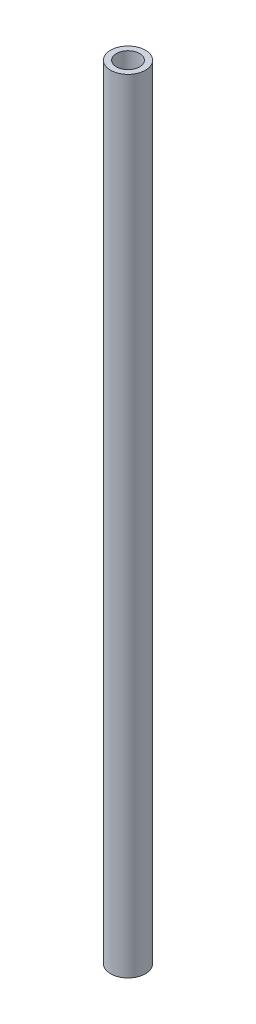
ISO-10303-21;
HEADER;
FILE_DESCRIPTION(('STEP AP214'),'2;1');
FILE_NAME('part.step','',(''),(''),'','','');
FILE_SCHEMA(('AUTOMOTIVE_DESIGN { 1 0 10303 214 1 1 1 1 }'));
ENDSEC;
DATA;
#1=APPLICATION_CONTEXT('core data for automotive mechanical design processes');
#2=APPLICATION_PROTOCOL_DEFINITION('international standard','automotive_design',2000,#1);
#3=PRODUCT_CONTEXT('',#1,'mechanical');
#4=PRODUCT('Part','Part','',(#3));
#5=PRODUCT_RELATED_PRODUCT_CATEGORY('part','',(#4));
#6=PRODUCT_DEFINITION_FORMATION('','',#4);
#7=PRODUCT_DEFINITION_CONTEXT('part definition',#1,'design');
#8=PRODUCT_DEFINITION('design','',#6,#7);
#9=PRODUCT_DEFINITION_SHAPE('','',#8);
#10=(LENGTH_UNIT() NAMED_UNIT(*) SI_UNIT(.MILLI.,.METRE.));
#11=(NAMED_UNIT(*) PLANE_ANGLE_UNIT() SI_UNIT($,.RADIAN.));
#12=(NAMED_UNIT(*) SI_UNIT($,.STERADIAN.) SOLID_ANGLE_UNIT());
#13=UNCERTAINTY_MEASURE_WITH_UNIT(LENGTH_MEASURE(1.E-05),#10,'distance_accuracy_value','');
#14=(GEOMETRIC_REPRESENTATION_CONTEXT(3) GLOBAL_UNCERTAINTY_ASSIGNED_CONTEXT((#13)) GLOBAL_UNIT_ASSIGNED_CONTEXT((#10,
#11,#12)) REPRESENTATION_CONTEXT('',''));
#15=CARTESIAN_POINT('',(0.,0.,0.));
#16=DIRECTION('',(0.,0.,1.));
#17=DIRECTION('',(1.,0.,0.));
#18=AXIS2_PLACEMENT_3D('',#15,#16,#17);
#19=CARTESIAN_POINT('',(3.,-100.,0.));
#20=DIRECTION('',(0.,-1.,0.));
#21=DIRECTION('',(0.,0.,-1.));
#22=AXIS2_PLACEMENT_3D('',#19,#20,#21);
#23=PLANE('',#22);
#24=CARTESIAN_POINT('',(0.,-100.,0.));
#25=DIRECTION('',(0.,-1.,0.));
#26=DIRECTION('',(0.,0.,-1.));
#27=AXIS2_PLACEMENT_3D('',#24,#25,#26);
#28=CIRCLE('',#27,3.);
#29=CARTESIAN_POINT('',(0.,-100.,-3.));
#30=VERTEX_POINT('',#29);
#31=EDGE_CURVE('E49',#30,#30,#28,.T.);
#32=ORIENTED_EDGE('',*,*,#31,.T.);
#33=EDGE_LOOP('',(#32));
#34=FACE_BOUND('',#33,.T.);
#35=CARTESIAN_POINT('',(0.,-100.,0.));
#36=DIRECTION('',(0.,-1.,0.));
#37=DIRECTION('',(0.,0.,-1.));
#38=AXIS2_PLACEMENT_3D('',#35,#36,#37);
#39=CIRCLE('',#38,2.);
#40=CARTESIAN_POINT('',(0.,-100.,-2.));
#41=VERTEX_POINT('',#40);
#42=EDGE_CURVE('E10',#41,#41,#39,.T.);
#43=ORIENTED_EDGE('',*,*,#42,.F.);
#44=EDGE_LOOP('',(#43));
#45=FACE_BOUND('',#44,.T.);
#46=ADVANCED_FACE('F35',(#34,#45),#23,.T.);
#47=CARTESIAN_POINT('',(0.,-200.,0.));
#48=DIRECTION('',(0.,-1.,0.));
#49=DIRECTION('',(0.,0.,-1.));
#50=AXIS2_PLACEMENT_3D('',#47,#48,#49);
#51=CYLINDRICAL_SURFACE('',#50,2.);
#52=ORIENTED_EDGE('',*,*,#42,.T.);
#53=EDGE_LOOP('',(#52));
#54=FACE_BOUND('',#53,.T.);
#55=CARTESIAN_POINT('',(0.,35.,0.));
#56=DIRECTION('',(0.,-1.,0.));
#57=DIRECTION('',(0.,0.,-1.));
#58=AXIS2_PLACEMENT_3D('',#55,#56,#57);
#59=CIRCLE('',#58,2.);
#60=CARTESIAN_POINT('',(0.,35.,-2.));
#61=VERTEX_POINT('',#60);
#62=EDGE_CURVE('E41',#61,#61,#59,.T.);
#63=ORIENTED_EDGE('',*,*,#62,.F.);
#64=EDGE_LOOP('',(#63));
#65=FACE_BOUND('',#64,.T.);
#66=ADVANCED_FACE('F65',(#54,#65),#51,.F.);
#67=CARTESIAN_POINT('',(2.,35.,0.));
#68=DIRECTION('',(0.,1.,0.));
#69=DIRECTION('',(0.,0.,1.));
#70=AXIS2_PLACEMENT_3D('',#67,#68,#69);
#71=PLANE('',#70);
#72=ORIENTED_EDGE('',*,*,#62,.T.);
#73=EDGE_LOOP('',(#72));
#74=FACE_BOUND('',#73,.T.);
#75=CARTESIAN_POINT('',(0.,35.,0.));
#76=DIRECTION('',(0.,-1.,0.));
#77=DIRECTION('',(0.,0.,-1.));
#78=AXIS2_PLACEMENT_3D('',#75,#76,#77);
#79=CIRCLE('',#78,3.);
#80=CARTESIAN_POINT('',(0.,35.,-3.));
#81=VERTEX_POINT('',#80);
#82=EDGE_CURVE('E45',#81,#81,#79,.T.);
#83=ORIENTED_EDGE('',*,*,#82,.F.);
#84=EDGE_LOOP('',(#83));
#85=FACE_BOUND('',#84,.T.);
#86=ADVANCED_FACE('F59',(#74,#85),#71,.T.);
#87=CARTESIAN_POINT('',(0.,-200.,0.));
#88=DIRECTION('',(0.,-1.,0.));
#89=DIRECTION('',(0.,0.,-1.));
#90=AXIS2_PLACEMENT_3D('',#87,#88,#89);
#91=CYLINDRICAL_SURFACE('',#90,3.);
#92=ORIENTED_EDGE('',*,*,#82,.T.);
#93=EDGE_LOOP('',(#92));
#94=FACE_BOUND('',#93,.T.);
#95=ORIENTED_EDGE('',*,*,#31,.F.);
#96=EDGE_LOOP('',(#95));
#97=FACE_BOUND('',#96,.T.);
#98=ADVANCED_FACE('F57',(#94,#97),#91,.T.);
#99=CLOSED_SHELL('',(#46,#66,#86,#98));
#100=MANIFOLD_SOLID_BREP('B2',#99);
#101=ADVANCED_BREP_SHAPE_REPRESENTATION('',(#18,#100),#14);
#102=SHAPE_DEFINITION_REPRESENTATION(#9,#101);
ENDSEC;
END-ISO-10303-21;
